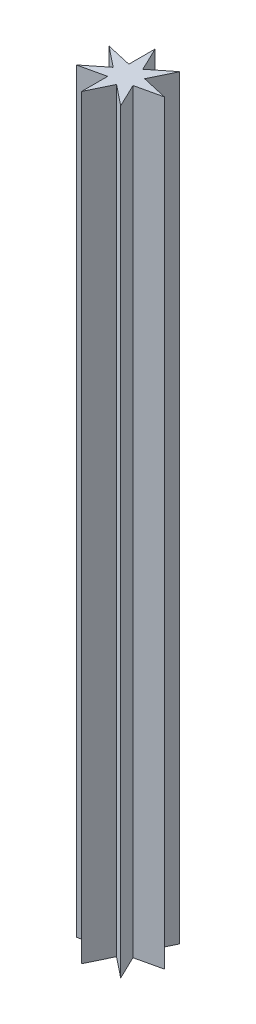
ISO-10303-21;
HEADER;
FILE_DESCRIPTION(('STEP AP214'),'2;1');
FILE_NAME('part.step','',(''),(''),'','','');
FILE_SCHEMA(('AUTOMOTIVE_DESIGN { 1 0 10303 214 1 1 1 1 }'));
ENDSEC;
DATA;
#1=APPLICATION_CONTEXT('core data for automotive mechanical design processes');
#2=APPLICATION_PROTOCOL_DEFINITION('international standard','automotive_design',2000,#1);
#3=PRODUCT_CONTEXT('',#1,'mechanical');
#4=PRODUCT('Part','Part','',(#3));
#5=PRODUCT_RELATED_PRODUCT_CATEGORY('part','',(#4));
#6=PRODUCT_DEFINITION_FORMATION('','',#4);
#7=PRODUCT_DEFINITION_CONTEXT('part definition',#1,'design');
#8=PRODUCT_DEFINITION('design','',#6,#7);
#9=PRODUCT_DEFINITION_SHAPE('','',#8);
#10=(LENGTH_UNIT() NAMED_UNIT(*) SI_UNIT(.MILLI.,.METRE.));
#11=(NAMED_UNIT(*) PLANE_ANGLE_UNIT() SI_UNIT($,.RADIAN.));
#12=(NAMED_UNIT(*) SI_UNIT($,.STERADIAN.) SOLID_ANGLE_UNIT());
#13=UNCERTAINTY_MEASURE_WITH_UNIT(LENGTH_MEASURE(1.E-05),#10,'distance_accuracy_value','');
#14=(GEOMETRIC_REPRESENTATION_CONTEXT(3) GLOBAL_UNCERTAINTY_ASSIGNED_CONTEXT((#13)) GLOBAL_UNIT_ASSIGNED_CONTEXT((#10,
#11,#12)) REPRESENTATION_CONTEXT('',''));
#15=CARTESIAN_POINT('',(0.,0.,0.));
#16=DIRECTION('',(0.,0.,1.));
#17=DIRECTION('',(1.,0.,0.));
#18=AXIS2_PLACEMENT_3D('',#15,#16,#17);
#19=CARTESIAN_POINT('',(0.314423844409819,127.,1.37758087169825));
#20=DIRECTION('',(-0.222520933956314,0.,-0.974927912181824));
#21=DIRECTION('',(-0.974927912181824,0.,0.222520933956314));
#22=AXIS2_PLACEMENT_3D('',#19,#20,#21);
#23=PLANE('',#22);
#24=DIRECTION('',(0.974927912181824,0.,-0.222520933956314));
#25=VECTOR('',#24,1.);
#26=CARTESIAN_POINT('',(0.314423844409819,0.,1.37758087169825));
#27=LINE('',#26,#25);
#28=CARTESIAN_POINT('',(-5.72115231118037,0.,2.75516174339649));
#29=VERTEX_POINT('',#28);
#30=CARTESIAN_POINT('',(-1.4130079306226,0.,1.77185590180359));
#31=VERTEX_POINT('',#30);
#32=EDGE_CURVE('E180',#29,#31,#27,.T.);
#33=ORIENTED_EDGE('',*,*,#32,.T.);
#34=DIRECTION('',(0.,-1.,0.));
#35=VECTOR('',#34,1.);
#36=CARTESIAN_POINT('',(-1.4130079306226,127.,1.77185590180359));
#37=LINE('',#36,#35);
#38=CARTESIAN_POINT('',(-1.4130079306226,127.,1.77185590180359));
#39=VERTEX_POINT('',#38);
#40=EDGE_CURVE('E11',#39,#31,#37,.T.);
#41=ORIENTED_EDGE('',*,*,#40,.F.);
#42=DIRECTION('',(0.974927912181824,0.,-0.222520933956314));
#43=VECTOR('',#42,1.);
#44=CARTESIAN_POINT('',(0.314423844409819,127.,1.37758087169825));
#45=LINE('',#44,#43);
#46=CARTESIAN_POINT('',(-5.72115231118037,127.,2.75516174339649));
#47=VERTEX_POINT('',#46);
#48=EDGE_CURVE('E230',#47,#39,#45,.T.);
#49=ORIENTED_EDGE('',*,*,#48,.F.);
#50=DIRECTION('',(0.,-1.,0.));
#51=VECTOR('',#50,1.);
#52=CARTESIAN_POINT('',(-5.72115231118037,127.,2.75516174339649));
#53=LINE('',#52,#51);
#54=EDGE_CURVE('E58',#47,#29,#53,.T.);
#55=ORIENTED_EDGE('',*,*,#54,.T.);
#56=EDGE_LOOP('',(#33,#41,#49,#55));
#57=FACE_BOUND('',#56,.T.);
#58=ADVANCED_FACE('F41',(#57),#23,.F.);
#59=CARTESIAN_POINT('',(-1.4130079306226,127.,0.));
#60=DIRECTION('',(1.,0.,0.));
#61=DIRECTION('',(0.,0.,-1.));
#62=AXIS2_PLACEMENT_3D('',#59,#60,#61);
#63=PLANE('',#62);
#64=DIRECTION('',(0.,0.,1.));
#65=VECTOR('',#64,1.);
#66=CARTESIAN_POINT('',(-1.4130079306226,0.,0.));
#67=LINE('',#66,#65);
#68=CARTESIAN_POINT('',(-1.4130079306226,0.,6.19079224235458));
#69=VERTEX_POINT('',#68);
#70=EDGE_CURVE('E183',#31,#69,#67,.T.);
#71=ORIENTED_EDGE('',*,*,#70,.T.);
#72=DIRECTION('',(0.,-1.,0.));
#73=VECTOR('',#72,1.);
#74=CARTESIAN_POINT('',(-1.4130079306226,127.,6.19079224235458));
#75=LINE('',#74,#73);
#76=CARTESIAN_POINT('',(-1.4130079306226,127.,6.19079224235458));
#77=VERTEX_POINT('',#76);
#78=EDGE_CURVE('E50',#77,#69,#75,.T.);
#79=ORIENTED_EDGE('',*,*,#78,.F.);
#80=DIRECTION('',(0.,0.,1.));
#81=VECTOR('',#80,1.);
#82=CARTESIAN_POINT('',(-1.4130079306226,127.,0.));
#83=LINE('',#82,#81);
#84=EDGE_CURVE('E115',#39,#77,#83,.T.);
#85=ORIENTED_EDGE('',*,*,#84,.F.);
#86=ORIENTED_EDGE('',*,*,#40,.T.);
#87=EDGE_LOOP('',(#71,#79,#85,#86));
#88=FACE_BOUND('',#87,.T.);
#89=ADVANCED_FACE('F268',(#88),#63,.F.);
#90=CARTESIAN_POINT('',(1.27307615559018,127.,0.613081164341293));
#91=DIRECTION('',(0.900968867902419,0.,0.433883739117558));
#92=DIRECTION('',(0.433883739117558,0.,-0.900968867902419));
#93=AXIS2_PLACEMENT_3D('',#90,#91,#92);
#94=PLANE('',#93);
#95=DIRECTION('',(-0.433883739117558,0.,0.900968867902419));
#96=VECTOR('',#95,1.);
#97=CARTESIAN_POINT('',(1.27307615559018,0.,0.613081164341293));
#98=LINE('',#97,#96);
#99=CARTESIAN_POINT('',(0.504296691738121,0.,2.20946817027549));
#100=VERTEX_POINT('',#99);
#101=EDGE_CURVE('E187',#100,#69,#98,.T.);
#102=ORIENTED_EDGE('',*,*,#101,.F.);
#103=DIRECTION('',(0.,-1.,0.));
#104=VECTOR('',#103,1.);
#105=CARTESIAN_POINT('',(0.504296691738121,127.,2.20946817027549));
#106=LINE('',#105,#104);
#107=CARTESIAN_POINT('',(0.504296691738121,127.,2.20946817027549));
#108=VERTEX_POINT('',#107);
#109=EDGE_CURVE('E259',#108,#100,#106,.T.);
#110=ORIENTED_EDGE('',*,*,#109,.F.);
#111=DIRECTION('',(-0.433883739117558,0.,0.900968867902419));
#112=VECTOR('',#111,1.);
#113=CARTESIAN_POINT('',(1.27307615559018,127.,0.613081164341293));
#114=LINE('',#113,#112);
#115=EDGE_CURVE('E267',#108,#77,#114,.T.);
#116=ORIENTED_EDGE('',*,*,#115,.T.);
#117=ORIENTED_EDGE('',*,*,#78,.T.);
#118=EDGE_LOOP('',(#102,#110,#116,#117));
#119=FACE_BOUND('',#118,.T.);
#120=ADVANCED_FACE('F265',(#119),#94,.T.);
#121=CARTESIAN_POINT('',(-0.880996034688703,127.,1.10473408513775));
#122=DIRECTION('',(0.623489801858733,0.,-0.78183148246803));
#123=DIRECTION('',(-0.78183148246803,0.,-0.623489801858733));
#124=AXIS2_PLACEMENT_3D('',#121,#122,#123);
#125=PLANE('',#124);
#126=DIRECTION('',(0.78183148246803,0.,0.623489801858733));
#127=VECTOR('',#126,1.);
#128=CARTESIAN_POINT('',(-0.880996034688703,0.,1.10473408513775));
#129=LINE('',#128,#127);
#130=CARTESIAN_POINT('',(3.95916024180296,0.,4.96462991367199));
#131=VERTEX_POINT('',#130);
#132=EDGE_CURVE('E191',#100,#131,#129,.T.);
#133=ORIENTED_EDGE('',*,*,#132,.T.);
#134=DIRECTION('',(0.,-1.,0.));
#135=VECTOR('',#134,1.);
#136=CARTESIAN_POINT('',(3.95916024180296,127.,4.96462991367199));
#137=LINE('',#136,#135);
#138=CARTESIAN_POINT('',(3.95916024180296,127.,4.96462991367199));
#139=VERTEX_POINT('',#138);
#140=EDGE_CURVE('E256',#139,#131,#137,.T.);
#141=ORIENTED_EDGE('',*,*,#140,.F.);
#142=DIRECTION('',(0.78183148246803,0.,0.623489801858733));
#143=VECTOR('',#142,1.);
#144=CARTESIAN_POINT('',(-0.880996034688703,127.,1.10473408513775));
#145=LINE('',#144,#143);
#146=EDGE_CURVE('E280',#108,#139,#145,.T.);
#147=ORIENTED_EDGE('',*,*,#146,.F.);
#148=ORIENTED_EDGE('',*,*,#109,.T.);
#149=EDGE_LOOP('',(#133,#141,#147,#148));
#150=FACE_BOUND('',#149,.T.);
#151=ADVANCED_FACE('F277',(#150),#125,.F.);
#152=CARTESIAN_POINT('',(1.27307615559018,127.,-0.613081164341297));
#153=DIRECTION('',(0.900968867902419,0.,-0.433883739117558));
#154=DIRECTION('',(-0.433883739117558,0.,-0.900968867902419));
#155=AXIS2_PLACEMENT_3D('',#152,#153,#154);
#156=PLANE('',#155);
#157=DIRECTION('',(0.433883739117558,0.,0.900968867902419));
#158=VECTOR('',#157,1.);
#159=CARTESIAN_POINT('',(1.27307615559018,0.,-0.613081164341297));
#160=LINE('',#159,#158);
#161=CARTESIAN_POINT('',(2.04185561944224,0.,0.983305841592907));
#162=VERTEX_POINT('',#161);
#163=EDGE_CURVE('E195',#162,#131,#160,.T.);
#164=ORIENTED_EDGE('',*,*,#163,.F.);
#165=DIRECTION('',(0.,-1.,0.));
#166=VECTOR('',#165,1.);
#167=CARTESIAN_POINT('',(2.04185561944224,127.,0.983305841592907));
#168=LINE('',#167,#166);
#169=CARTESIAN_POINT('',(2.04185561944224,127.,0.983305841592907));
#170=VERTEX_POINT('',#169);
#171=EDGE_CURVE('E253',#170,#162,#168,.T.);
#172=ORIENTED_EDGE('',*,*,#171,.F.);
#173=DIRECTION('',(0.433883739117558,0.,0.900968867902419));
#174=VECTOR('',#173,1.);
#175=CARTESIAN_POINT('',(1.27307615559018,127.,-0.613081164341297));
#176=LINE('',#175,#174);
#177=EDGE_CURVE('E283',#170,#139,#176,.T.);
#178=ORIENTED_EDGE('',*,*,#177,.T.);
#179=ORIENTED_EDGE('',*,*,#140,.T.);
#180=EDGE_LOOP('',(#164,#172,#178,#179));
#181=FACE_BOUND('',#180,.T.);
#182=ADVANCED_FACE('F419',(#181),#156,.T.);
#183=CARTESIAN_POINT('',(0.314423844409819,127.,1.37758087169825));
#184=DIRECTION('',(-0.222520933956314,0.,-0.974927912181824));
#185=DIRECTION('',(-0.974927912181824,0.,0.222520933956314));
#186=AXIS2_PLACEMENT_3D('',#183,#184,#185);
#187=PLANE('',#186);
#188=DIRECTION('',(0.974927912181824,0.,-0.222520933956314));
#189=VECTOR('',#188,1.);
#190=CARTESIAN_POINT('',(0.314423844409819,0.,1.37758087169825));
#191=LINE('',#190,#189);
#192=CARTESIAN_POINT('',(6.35,0.,0.));
#193=VERTEX_POINT('',#192);
#194=EDGE_CURVE('E199',#162,#193,#191,.T.);
#195=ORIENTED_EDGE('',*,*,#194,.T.);
#196=DIRECTION('',(0.,-1.,0.));
#197=VECTOR('',#196,1.);
#198=CARTESIAN_POINT('',(6.35,127.,0.));
#199=LINE('',#198,#197);
#200=CARTESIAN_POINT('',(6.35,127.,0.));
#201=VERTEX_POINT('',#200);
#202=EDGE_CURVE('E249',#201,#193,#199,.T.);
#203=ORIENTED_EDGE('',*,*,#202,.F.);
#204=DIRECTION('',(0.974927912181824,0.,-0.222520933956314));
#205=VECTOR('',#204,1.);
#206=CARTESIAN_POINT('',(0.314423844409819,127.,1.37758087169825));
#207=LINE('',#206,#205);
#208=EDGE_CURVE('E293',#170,#201,#207,.T.);
#209=ORIENTED_EDGE('',*,*,#208,.F.);
#210=ORIENTED_EDGE('',*,*,#171,.T.);
#211=EDGE_LOOP('',(#195,#203,#209,#210));
#212=FACE_BOUND('',#211,.T.);
#213=ADVANCED_FACE('F409',(#212),#187,.F.);
#214=CARTESIAN_POINT('',(0.314423844409819,127.,-1.37758087169824));
#215=DIRECTION('',(-0.222520933956315,0.,0.974927912181824));
#216=DIRECTION('',(0.974927912181824,0.,0.222520933956315));
#217=AXIS2_PLACEMENT_3D('',#214,#215,#216);
#218=PLANE('',#217);
#219=DIRECTION('',(-0.974927912181824,0.,-0.222520933956315));
#220=VECTOR('',#219,1.);
#221=CARTESIAN_POINT('',(0.314423844409819,0.,-1.37758087169824));
#222=LINE('',#221,#220);
#223=CARTESIAN_POINT('',(2.04185561944223,0.,-0.983305841592902));
#224=VERTEX_POINT('',#223);
#225=EDGE_CURVE('E202',#193,#224,#222,.T.);
#226=ORIENTED_EDGE('',*,*,#225,.T.);
#227=DIRECTION('',(0.,-1.,0.));
#228=VECTOR('',#227,1.);
#229=CARTESIAN_POINT('',(2.04185561944223,127.,-0.983305841592902));
#230=LINE('',#229,#228);
#231=CARTESIAN_POINT('',(2.04185561944223,127.,-0.983305841592902));
#232=VERTEX_POINT('',#231);
#233=EDGE_CURVE('E246',#232,#224,#230,.T.);
#234=ORIENTED_EDGE('',*,*,#233,.F.);
#235=DIRECTION('',(-0.974927912181824,0.,-0.222520933956315));
#236=VECTOR('',#235,1.);
#237=CARTESIAN_POINT('',(0.314423844409819,127.,-1.37758087169824));
#238=LINE('',#237,#236);
#239=EDGE_CURVE('E296',#201,#232,#238,.T.);
#240=ORIENTED_EDGE('',*,*,#239,.F.);
#241=ORIENTED_EDGE('',*,*,#202,.T.);
#242=EDGE_LOOP('',(#226,#234,#240,#241));
#243=FACE_BOUND('',#242,.T.);
#244=ADVANCED_FACE('F399',(#243),#218,.F.);
#245=CARTESIAN_POINT('',(1.27307615559018,127.,0.613081164341293));
#246=DIRECTION('',(0.900968867902419,0.,0.433883739117558));
#247=DIRECTION('',(0.433883739117558,0.,-0.900968867902419));
#248=AXIS2_PLACEMENT_3D('',#245,#246,#247);
#249=PLANE('',#248);
#250=DIRECTION('',(-0.433883739117558,0.,0.900968867902419));
#251=VECTOR('',#250,1.);
#252=CARTESIAN_POINT('',(1.27307615559018,0.,0.613081164341293));
#253=LINE('',#252,#251);
#254=CARTESIAN_POINT('',(3.95916024180296,0.,-4.964629913672));
#255=VERTEX_POINT('',#254);
#256=EDGE_CURVE('E206',#255,#224,#253,.T.);
#257=ORIENTED_EDGE('',*,*,#256,.F.);
#258=DIRECTION('',(0.,-1.,0.));
#259=VECTOR('',#258,1.);
#260=CARTESIAN_POINT('',(3.95916024180296,127.,-4.964629913672));
#261=LINE('',#260,#259);
#262=CARTESIAN_POINT('',(3.95916024180296,127.,-4.964629913672));
#263=VERTEX_POINT('',#262);
#264=EDGE_CURVE('E243',#263,#255,#261,.T.);
#265=ORIENTED_EDGE('',*,*,#264,.F.);
#266=DIRECTION('',(-0.433883739117558,0.,0.900968867902419));
#267=VECTOR('',#266,1.);
#268=CARTESIAN_POINT('',(1.27307615559018,127.,0.613081164341293));
#269=LINE('',#268,#267);
#270=EDGE_CURVE('E299',#263,#232,#269,.T.);
#271=ORIENTED_EDGE('',*,*,#270,.T.);
#272=ORIENTED_EDGE('',*,*,#233,.T.);
#273=EDGE_LOOP('',(#257,#265,#271,#272));
#274=FACE_BOUND('',#273,.T.);
#275=ADVANCED_FACE('F390',(#274),#249,.T.);
#276=CARTESIAN_POINT('',(-0.880996034688707,127.,-1.10473408513775));
#277=DIRECTION('',(-0.623489801858734,0.,-0.78183148246803));
#278=DIRECTION('',(-0.78183148246803,0.,0.623489801858734));
#279=AXIS2_PLACEMENT_3D('',#276,#277,#278);
#280=PLANE('',#279);
#281=DIRECTION('',(0.78183148246803,0.,-0.623489801858734));
#282=VECTOR('',#281,1.);
#283=CARTESIAN_POINT('',(-0.880996034688707,0.,-1.10473408513775));
#284=LINE('',#283,#282);
#285=CARTESIAN_POINT('',(0.504296691738126,0.,-2.20946817027551));
#286=VERTEX_POINT('',#285);
#287=EDGE_CURVE('E210',#286,#255,#284,.T.);
#288=ORIENTED_EDGE('',*,*,#287,.F.);
#289=DIRECTION('',(0.,-1.,0.));
#290=VECTOR('',#289,1.);
#291=CARTESIAN_POINT('',(0.504296691738126,127.,-2.20946817027551));
#292=LINE('',#291,#290);
#293=CARTESIAN_POINT('',(0.504296691738126,127.,-2.20946817027551));
#294=VERTEX_POINT('',#293);
#295=EDGE_CURVE('E240',#294,#286,#292,.T.);
#296=ORIENTED_EDGE('',*,*,#295,.F.);
#297=DIRECTION('',(0.78183148246803,0.,-0.623489801858734));
#298=VECTOR('',#297,1.);
#299=CARTESIAN_POINT('',(-0.880996034688707,127.,-1.10473408513775));
#300=LINE('',#299,#298);
#301=EDGE_CURVE('E303',#294,#263,#300,.T.);
#302=ORIENTED_EDGE('',*,*,#301,.T.);
#303=ORIENTED_EDGE('',*,*,#264,.T.);
#304=EDGE_LOOP('',(#288,#296,#302,#303));
#305=FACE_BOUND('',#304,.T.);
#306=ADVANCED_FACE('F318',(#305),#280,.T.);
#307=CARTESIAN_POINT('',(1.27307615559018,127.,-0.613081164341297));
#308=DIRECTION('',(0.900968867902419,0.,-0.433883739117558));
#309=DIRECTION('',(-0.433883739117558,0.,-0.900968867902419));
#310=AXIS2_PLACEMENT_3D('',#307,#308,#309);
#311=PLANE('',#310);
#312=DIRECTION('',(0.433883739117558,0.,0.900968867902419));
#313=VECTOR('',#312,1.);
#314=CARTESIAN_POINT('',(1.27307615559018,0.,-0.613081164341297));
#315=LINE('',#314,#313);
#316=CARTESIAN_POINT('',(-1.4130079306226,0.,-6.19079224235459));
#317=VERTEX_POINT('',#316);
#318=EDGE_CURVE('E214',#317,#286,#315,.T.);
#319=ORIENTED_EDGE('',*,*,#318,.F.);
#320=DIRECTION('',(0.,-1.,0.));
#321=VECTOR('',#320,1.);
#322=CARTESIAN_POINT('',(-1.4130079306226,127.,-6.19079224235459));
#323=LINE('',#322,#321);
#324=CARTESIAN_POINT('',(-1.4130079306226,127.,-6.19079224235459));
#325=VERTEX_POINT('',#324);
#326=EDGE_CURVE('E237',#325,#317,#323,.T.);
#327=ORIENTED_EDGE('',*,*,#326,.F.);
#328=DIRECTION('',(0.433883739117558,0.,0.900968867902419));
#329=VECTOR('',#328,1.);
#330=CARTESIAN_POINT('',(1.27307615559018,127.,-0.613081164341297));
#331=LINE('',#330,#329);
#332=EDGE_CURVE('E307',#325,#294,#331,.T.);
#333=ORIENTED_EDGE('',*,*,#332,.T.);
#334=ORIENTED_EDGE('',*,*,#295,.T.);
#335=EDGE_LOOP('',(#319,#327,#333,#334));
#336=FACE_BOUND('',#335,.T.);
#337=ADVANCED_FACE('F313',(#336),#311,.T.);
#338=CARTESIAN_POINT('',(-1.4130079306226,127.,0.));
#339=DIRECTION('',(1.,0.,0.));
#340=DIRECTION('',(0.,0.,-1.));
#341=AXIS2_PLACEMENT_3D('',#338,#339,#340);
#342=PLANE('',#341);
#343=DIRECTION('',(0.,0.,1.));
#344=VECTOR('',#343,1.);
#345=CARTESIAN_POINT('',(-1.4130079306226,0.,0.));
#346=LINE('',#345,#344);
#347=CARTESIAN_POINT('',(-1.4130079306226,0.,-1.77185590180359));
#348=VERTEX_POINT('',#347);
#349=EDGE_CURVE('E218',#317,#348,#346,.T.);
#350=ORIENTED_EDGE('',*,*,#349,.T.);
#351=DIRECTION('',(0.,-1.,0.));
#352=VECTOR('',#351,1.);
#353=CARTESIAN_POINT('',(-1.4130079306226,127.,-1.77185590180359));
#354=LINE('',#353,#352);
#355=CARTESIAN_POINT('',(-1.4130079306226,127.,-1.77185590180359));
#356=VERTEX_POINT('',#355);
#357=EDGE_CURVE('E170',#356,#348,#354,.T.);
#358=ORIENTED_EDGE('',*,*,#357,.F.);
#359=DIRECTION('',(0.,0.,1.));
#360=VECTOR('',#359,1.);
#361=CARTESIAN_POINT('',(-1.4130079306226,127.,0.));
#362=LINE('',#361,#360);
#363=EDGE_CURVE('E156',#325,#356,#362,.T.);
#364=ORIENTED_EDGE('',*,*,#363,.F.);
#365=ORIENTED_EDGE('',*,*,#326,.T.);
#366=EDGE_LOOP('',(#350,#358,#364,#365));
#367=FACE_BOUND('',#366,.T.);
#368=ADVANCED_FACE('F322',(#367),#342,.F.);
#369=CARTESIAN_POINT('',(0.314423844409819,127.,-1.37758087169824));
#370=DIRECTION('',(-0.222520933956315,0.,0.974927912181824));
#371=DIRECTION('',(0.974927912181824,0.,0.222520933956315));
#372=AXIS2_PLACEMENT_3D('',#369,#370,#371);
#373=PLANE('',#372);
#374=DIRECTION('',(-0.974927912181824,0.,-0.222520933956315));
#375=VECTOR('',#374,1.);
#376=CARTESIAN_POINT('',(0.314423844409819,0.,-1.37758087169824));
#377=LINE('',#376,#375);
#378=CARTESIAN_POINT('',(-5.72115231118037,0.,-2.7551617433965));
#379=VERTEX_POINT('',#378);
#380=EDGE_CURVE('E166',#348,#379,#377,.T.);
#381=ORIENTED_EDGE('',*,*,#380,.T.);
#382=DIRECTION('',(0.,-1.,0.));
#383=VECTOR('',#382,1.);
#384=CARTESIAN_POINT('',(-5.72115231118037,127.,-2.7551617433965));
#385=LINE('',#384,#383);
#386=CARTESIAN_POINT('',(-5.72115231118037,127.,-2.7551617433965));
#387=VERTEX_POINT('',#386);
#388=EDGE_CURVE('E163',#387,#379,#385,.T.);
#389=ORIENTED_EDGE('',*,*,#388,.F.);
#390=DIRECTION('',(-0.974927912181824,0.,-0.222520933956315));
#391=VECTOR('',#390,1.);
#392=CARTESIAN_POINT('',(0.314423844409819,127.,-1.37758087169824));
#393=LINE('',#392,#391);
#394=EDGE_CURVE('E148',#356,#387,#393,.T.);
#395=ORIENTED_EDGE('',*,*,#394,.F.);
#396=ORIENTED_EDGE('',*,*,#357,.T.);
#397=EDGE_LOOP('',(#381,#389,#395,#396));
#398=FACE_BOUND('',#397,.T.);
#399=ADVANCED_FACE('F164',(#398),#373,.F.);
#400=CARTESIAN_POINT('',(-0.880996034688703,127.,1.10473408513775));
#401=DIRECTION('',(0.623489801858733,0.,-0.78183148246803));
#402=DIRECTION('',(-0.78183148246803,0.,-0.623489801858733));
#403=AXIS2_PLACEMENT_3D('',#400,#401,#402);
#404=PLANE('',#403);
#405=DIRECTION('',(0.78183148246803,0.,0.623489801858733));
#406=VECTOR('',#405,1.);
#407=CARTESIAN_POINT('',(-0.880996034688703,0.,1.10473408513775));
#408=LINE('',#407,#406);
#409=CARTESIAN_POINT('',(-2.26628876111554,0.,0.));
#410=VERTEX_POINT('',#409);
#411=EDGE_CURVE('E223',#379,#410,#408,.T.);
#412=ORIENTED_EDGE('',*,*,#411,.T.);
#413=DIRECTION('',(0.,-1.,0.));
#414=VECTOR('',#413,1.);
#415=CARTESIAN_POINT('',(-2.26628876111554,127.,0.));
#416=LINE('',#415,#414);
#417=CARTESIAN_POINT('',(-2.26628876111554,127.,0.));
#418=VERTEX_POINT('',#417);
#419=EDGE_CURVE('E103',#418,#410,#416,.T.);
#420=ORIENTED_EDGE('',*,*,#419,.F.);
#421=DIRECTION('',(0.78183148246803,0.,0.623489801858733));
#422=VECTOR('',#421,1.);
#423=CARTESIAN_POINT('',(-0.880996034688703,127.,1.10473408513775));
#424=LINE('',#423,#422);
#425=EDGE_CURVE('E153',#387,#418,#424,.T.);
#426=ORIENTED_EDGE('',*,*,#425,.F.);
#427=ORIENTED_EDGE('',*,*,#388,.T.);
#428=EDGE_LOOP('',(#412,#420,#426,#427));
#429=FACE_BOUND('',#428,.T.);
#430=ADVANCED_FACE('F172',(#429),#404,.F.);
#431=CARTESIAN_POINT('',(-0.880996034688707,127.,-1.10473408513775));
#432=DIRECTION('',(-0.623489801858734,0.,-0.78183148246803));
#433=DIRECTION('',(-0.78183148246803,0.,0.623489801858734));
#434=AXIS2_PLACEMENT_3D('',#431,#432,#433);
#435=PLANE('',#434);
#436=DIRECTION('',(0.78183148246803,0.,-0.623489801858734));
#437=VECTOR('',#436,1.);
#438=CARTESIAN_POINT('',(-0.880996034688707,0.,-1.10473408513775));
#439=LINE('',#438,#437);
#440=EDGE_CURVE('E226',#29,#410,#439,.T.);
#441=ORIENTED_EDGE('',*,*,#440,.F.);
#442=ORIENTED_EDGE('',*,*,#54,.F.);
#443=DIRECTION('',(0.78183148246803,0.,-0.623489801858734));
#444=VECTOR('',#443,1.);
#445=CARTESIAN_POINT('',(-0.880996034688707,127.,-1.10473408513775));
#446=LINE('',#445,#444);
#447=EDGE_CURVE('E174',#47,#418,#446,.T.);
#448=ORIENTED_EDGE('',*,*,#447,.T.);
#449=ORIENTED_EDGE('',*,*,#419,.T.);
#450=EDGE_LOOP('',(#441,#442,#448,#449));
#451=FACE_BOUND('',#450,.T.);
#452=ADVANCED_FACE('F335',(#451),#435,.T.);
#453=CARTESIAN_POINT('',(0.,127.,0.));
#454=DIRECTION('',(0.,1.,0.));
#455=DIRECTION('',(0.,0.,1.));
#456=AXIS2_PLACEMENT_3D('',#453,#454,#455);
#457=PLANE('',#456);
#458=ORIENTED_EDGE('',*,*,#48,.T.);
#459=ORIENTED_EDGE('',*,*,#84,.T.);
#460=ORIENTED_EDGE('',*,*,#115,.F.);
#461=ORIENTED_EDGE('',*,*,#146,.T.);
#462=ORIENTED_EDGE('',*,*,#177,.F.);
#463=ORIENTED_EDGE('',*,*,#208,.T.);
#464=ORIENTED_EDGE('',*,*,#239,.T.);
#465=ORIENTED_EDGE('',*,*,#270,.F.);
#466=ORIENTED_EDGE('',*,*,#301,.F.);
#467=ORIENTED_EDGE('',*,*,#332,.F.);
#468=ORIENTED_EDGE('',*,*,#363,.T.);
#469=ORIENTED_EDGE('',*,*,#394,.T.);
#470=ORIENTED_EDGE('',*,*,#425,.T.);
#471=ORIENTED_EDGE('',*,*,#447,.F.);
#472=EDGE_LOOP('',(#458,#459,#460,#461,#462,#463,#464,#465,#466,#467,#468,#469,#470,#471));
#473=FACE_BOUND('',#472,.T.);
#474=ADVANCED_FACE('F150',(#473),#457,.T.);
#475=CARTESIAN_POINT('',(0.,0.,0.));
#476=DIRECTION('',(0.,1.,0.));
#477=DIRECTION('',(0.,0.,1.));
#478=AXIS2_PLACEMENT_3D('',#475,#476,#477);
#479=PLANE('',#478);
#480=ORIENTED_EDGE('',*,*,#32,.F.);
#481=ORIENTED_EDGE('',*,*,#440,.T.);
#482=ORIENTED_EDGE('',*,*,#411,.F.);
#483=ORIENTED_EDGE('',*,*,#380,.F.);
#484=ORIENTED_EDGE('',*,*,#349,.F.);
#485=ORIENTED_EDGE('',*,*,#318,.T.);
#486=ORIENTED_EDGE('',*,*,#287,.T.);
#487=ORIENTED_EDGE('',*,*,#256,.T.);
#488=ORIENTED_EDGE('',*,*,#225,.F.);
#489=ORIENTED_EDGE('',*,*,#194,.F.);
#490=ORIENTED_EDGE('',*,*,#163,.T.);
#491=ORIENTED_EDGE('',*,*,#132,.F.);
#492=ORIENTED_EDGE('',*,*,#101,.T.);
#493=ORIENTED_EDGE('',*,*,#70,.F.);
#494=EDGE_LOOP('',(#480,#481,#482,#483,#484,#485,#486,#487,#488,#489,#490,#491,#492,#493));
#495=FACE_BOUND('',#494,.T.);
#496=ADVANCED_FACE('F272',(#495),#479,.F.);
#497=CLOSED_SHELL('',(#58,#89,#120,#151,#182,#213,#244,#275,#306,#337,#368,#399,#430,#452,#474,#496));
#498=MANIFOLD_SOLID_BREP('B2',#497);
#499=ADVANCED_BREP_SHAPE_REPRESENTATION('',(#18,#498),#14);
#500=SHAPE_DEFINITION_REPRESENTATION(#9,#499);
ENDSEC;
END-ISO-10303-21;
